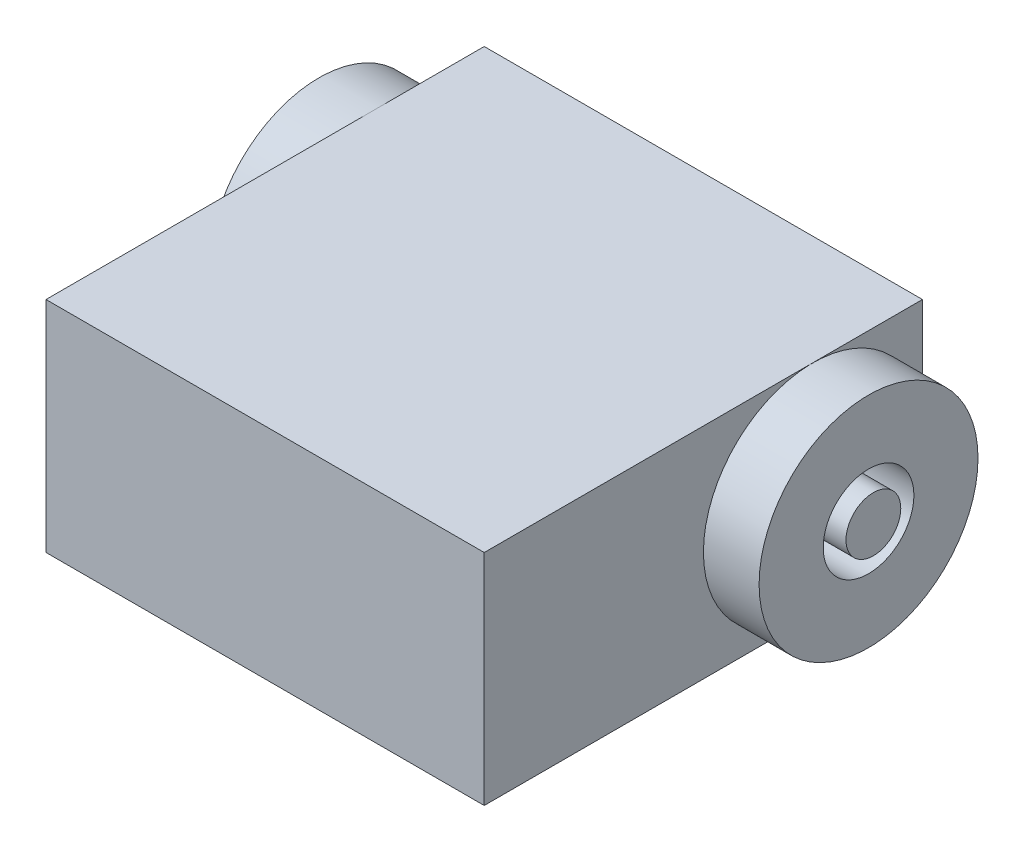
ISO-10303-21;
HEADER;
FILE_DESCRIPTION(('STEP AP214'),'2;1');
FILE_NAME('part.step','',(''),(''),'','','');
FILE_SCHEMA(('AUTOMOTIVE_DESIGN { 1 0 10303 214 1 1 1 1 }'));
ENDSEC;
DATA;
#1=APPLICATION_CONTEXT('core data for automotive mechanical design processes');
#2=APPLICATION_PROTOCOL_DEFINITION('international standard','automotive_design',2000,#1);
#3=PRODUCT_CONTEXT('',#1,'mechanical');
#4=PRODUCT('Part','Part','',(#3));
#5=PRODUCT_RELATED_PRODUCT_CATEGORY('part','',(#4));
#6=PRODUCT_DEFINITION_FORMATION('','',#4);
#7=PRODUCT_DEFINITION_CONTEXT('part definition',#1,'design');
#8=PRODUCT_DEFINITION('design','',#6,#7);
#9=PRODUCT_DEFINITION_SHAPE('','',#8);
#10=(LENGTH_UNIT() NAMED_UNIT(*) SI_UNIT(.MILLI.,.METRE.));
#11=(NAMED_UNIT(*) PLANE_ANGLE_UNIT() SI_UNIT($,.RADIAN.));
#12=(NAMED_UNIT(*) SI_UNIT($,.STERADIAN.) SOLID_ANGLE_UNIT());
#13=UNCERTAINTY_MEASURE_WITH_UNIT(LENGTH_MEASURE(1.E-05),#10,'distance_accuracy_value','');
#14=(GEOMETRIC_REPRESENTATION_CONTEXT(3) GLOBAL_UNCERTAINTY_ASSIGNED_CONTEXT((#13)) GLOBAL_UNIT_ASSIGNED_CONTEXT((#10,
#11,#12)) REPRESENTATION_CONTEXT('',''));
#15=CARTESIAN_POINT('',(0.,0.,0.));
#16=DIRECTION('',(0.,0.,1.));
#17=DIRECTION('',(1.,0.,0.));
#18=AXIS2_PLACEMENT_3D('',#15,#16,#17);
#19=CARTESIAN_POINT('',(-20.,20.,20.));
#20=DIRECTION('',(1.,0.,0.));
#21=DIRECTION('',(0.,0.,-1.));
#22=AXIS2_PLACEMENT_3D('',#19,#20,#21);
#23=PLANE('',#22);
#24=CARTESIAN_POINT('',(-20.,10.,-10.));
#25=DIRECTION('',(1.,0.,0.));
#26=DIRECTION('',(0.,0.,-1.));
#27=AXIS2_PLACEMENT_3D('',#24,#25,#26);
#28=CIRCLE('',#27,9.99095764515828);
#29=CARTESIAN_POINT('',(-20.,10.,-19.9909576451583));
#30=VERTEX_POINT('',#29);
#31=EDGE_CURVE('E224',#30,#30,#28,.T.);
#32=ORIENTED_EDGE('',*,*,#31,.T.);
#33=EDGE_LOOP('',(#32));
#34=FACE_BOUND('',#33,.T.);
#35=DIRECTION('',(0.,0.,1.));
#36=VECTOR('',#35,1.);
#37=CARTESIAN_POINT('',(-20.,0.,20.));
#38=LINE('',#37,#36);
#39=CARTESIAN_POINT('',(-20.,0.,-20.));
#40=VERTEX_POINT('',#39);
#41=CARTESIAN_POINT('',(-20.,0.,20.));
#42=VERTEX_POINT('',#41);
#43=EDGE_CURVE('E110',#40,#42,#38,.T.);
#44=ORIENTED_EDGE('',*,*,#43,.T.);
#45=DIRECTION('',(0.,-1.,0.));
#46=VECTOR('',#45,1.);
#47=CARTESIAN_POINT('',(-20.,20.,20.));
#48=LINE('',#47,#46);
#49=CARTESIAN_POINT('',(-20.,20.,20.));
#50=VERTEX_POINT('',#49);
#51=EDGE_CURVE('E101',#50,#42,#48,.T.);
#52=ORIENTED_EDGE('',*,*,#51,.F.);
#53=DIRECTION('',(0.,0.,1.));
#54=VECTOR('',#53,1.);
#55=CARTESIAN_POINT('',(-20.,20.,20.));
#56=LINE('',#55,#54);
#57=CARTESIAN_POINT('',(-20.,20.,-20.));
#58=VERTEX_POINT('',#57);
#59=EDGE_CURVE('E95',#58,#50,#56,.T.);
#60=ORIENTED_EDGE('',*,*,#59,.F.);
#61=DIRECTION('',(0.,-1.,0.));
#62=VECTOR('',#61,1.);
#63=CARTESIAN_POINT('',(-20.,20.,-20.));
#64=LINE('',#63,#62);
#65=EDGE_CURVE('E106',#58,#40,#64,.T.);
#66=ORIENTED_EDGE('',*,*,#65,.T.);
#67=EDGE_LOOP('',(#44,#52,#60,#66));
#68=FACE_BOUND('',#67,.T.);
#69=ADVANCED_FACE('F43',(#34,#68),#23,.F.);
#70=CARTESIAN_POINT('',(-20.,20.,20.));
#71=DIRECTION('',(0.,0.,-1.));
#72=DIRECTION('',(-1.,0.,0.));
#73=AXIS2_PLACEMENT_3D('',#70,#71,#72);
#74=PLANE('',#73);
#75=DIRECTION('',(1.,0.,0.));
#76=VECTOR('',#75,1.);
#77=CARTESIAN_POINT('',(-20.,0.,20.));
#78=LINE('',#77,#76);
#79=CARTESIAN_POINT('',(20.,0.,20.));
#80=VERTEX_POINT('',#79);
#81=EDGE_CURVE('E100',#42,#80,#78,.T.);
#82=ORIENTED_EDGE('',*,*,#81,.T.);
#83=DIRECTION('',(0.,-1.,0.));
#84=VECTOR('',#83,1.);
#85=CARTESIAN_POINT('',(20.,20.,20.));
#86=LINE('',#85,#84);
#87=CARTESIAN_POINT('',(20.,20.,20.));
#88=VERTEX_POINT('',#87);
#89=EDGE_CURVE('E98',#88,#80,#86,.T.);
#90=ORIENTED_EDGE('',*,*,#89,.F.);
#91=DIRECTION('',(1.,0.,0.));
#92=VECTOR('',#91,1.);
#93=CARTESIAN_POINT('',(-20.,20.,20.));
#94=LINE('',#93,#92);
#95=EDGE_CURVE('E90',#50,#88,#94,.T.);
#96=ORIENTED_EDGE('',*,*,#95,.F.);
#97=ORIENTED_EDGE('',*,*,#51,.T.);
#98=EDGE_LOOP('',(#82,#90,#96,#97));
#99=FACE_BOUND('',#98,.T.);
#100=ADVANCED_FACE('F99',(#99),#74,.F.);
#101=CARTESIAN_POINT('',(20.,20.,20.));
#102=DIRECTION('',(-1.,0.,0.));
#103=DIRECTION('',(0.,0.,1.));
#104=AXIS2_PLACEMENT_3D('',#101,#102,#103);
#105=PLANE('',#104);
#106=CARTESIAN_POINT('',(20.,10.,-10.));
#107=DIRECTION('',(-1.,0.,0.));
#108=DIRECTION('',(0.,0.,1.));
#109=AXIS2_PLACEMENT_3D('',#106,#107,#108);
#110=CIRCLE('',#109,9.99095764515828);
#111=CARTESIAN_POINT('',(20.,10.,-0.00904235484172101));
#112=VERTEX_POINT('',#111);
#113=EDGE_CURVE('E51',#112,#112,#110,.F.);
#114=ORIENTED_EDGE('',*,*,#113,.F.);
#115=EDGE_LOOP('',(#114));
#116=FACE_BOUND('',#115,.T.);
#117=DIRECTION('',(0.,0.,-1.));
#118=VECTOR('',#117,1.);
#119=CARTESIAN_POINT('',(20.,0.,20.));
#120=LINE('',#119,#118);
#121=CARTESIAN_POINT('',(20.,0.,-20.));
#122=VERTEX_POINT('',#121);
#123=EDGE_CURVE('E76',#80,#122,#120,.T.);
#124=ORIENTED_EDGE('',*,*,#123,.T.);
#125=DIRECTION('',(0.,-1.,0.));
#126=VECTOR('',#125,1.);
#127=CARTESIAN_POINT('',(20.,20.,-20.));
#128=LINE('',#127,#126);
#129=CARTESIAN_POINT('',(20.,20.,-20.));
#130=VERTEX_POINT('',#129);
#131=EDGE_CURVE('E102',#130,#122,#128,.T.);
#132=ORIENTED_EDGE('',*,*,#131,.F.);
#133=DIRECTION('',(0.,0.,-1.));
#134=VECTOR('',#133,1.);
#135=CARTESIAN_POINT('',(20.,20.,20.));
#136=LINE('',#135,#134);
#137=EDGE_CURVE('E93',#88,#130,#136,.T.);
#138=ORIENTED_EDGE('',*,*,#137,.F.);
#139=ORIENTED_EDGE('',*,*,#89,.T.);
#140=EDGE_LOOP('',(#124,#132,#138,#139));
#141=FACE_BOUND('',#140,.T.);
#142=ADVANCED_FACE('F104',(#116,#141),#105,.F.);
#143=CARTESIAN_POINT('',(-20.,20.,-20.));
#144=DIRECTION('',(0.,0.,1.));
#145=DIRECTION('',(1.,0.,0.));
#146=AXIS2_PLACEMENT_3D('',#143,#144,#145);
#147=PLANE('',#146);
#148=DIRECTION('',(-1.,0.,0.));
#149=VECTOR('',#148,1.);
#150=CARTESIAN_POINT('',(-20.,0.,-20.));
#151=LINE('',#150,#149);
#152=EDGE_CURVE('E82',#122,#40,#151,.T.);
#153=ORIENTED_EDGE('',*,*,#152,.T.);
#154=ORIENTED_EDGE('',*,*,#65,.F.);
#155=DIRECTION('',(-1.,0.,0.));
#156=VECTOR('',#155,1.);
#157=CARTESIAN_POINT('',(-20.,20.,-20.));
#158=LINE('',#157,#156);
#159=EDGE_CURVE('E59',#130,#58,#158,.T.);
#160=ORIENTED_EDGE('',*,*,#159,.F.);
#161=ORIENTED_EDGE('',*,*,#131,.T.);
#162=EDGE_LOOP('',(#153,#154,#160,#161));
#163=FACE_BOUND('',#162,.T.);
#164=ADVANCED_FACE('F128',(#163),#147,.F.);
#165=CARTESIAN_POINT('',(0.,20.,0.));
#166=DIRECTION('',(0.,-1.,0.));
#167=DIRECTION('',(0.,0.,-1.));
#168=AXIS2_PLACEMENT_3D('',#165,#166,#167);
#169=PLANE('',#168);
#170=ORIENTED_EDGE('',*,*,#59,.T.);
#171=ORIENTED_EDGE('',*,*,#95,.T.);
#172=ORIENTED_EDGE('',*,*,#137,.T.);
#173=ORIENTED_EDGE('',*,*,#159,.T.);
#174=EDGE_LOOP('',(#170,#171,#172,#173));
#175=FACE_BOUND('',#174,.T.);
#176=ADVANCED_FACE('F91',(#175),#169,.F.);
#177=CARTESIAN_POINT('',(0.,0.,0.));
#178=DIRECTION('',(0.,-1.,0.));
#179=DIRECTION('',(0.,0.,-1.));
#180=AXIS2_PLACEMENT_3D('',#177,#178,#179);
#181=PLANE('',#180);
#182=ORIENTED_EDGE('',*,*,#43,.F.);
#183=ORIENTED_EDGE('',*,*,#152,.F.);
#184=ORIENTED_EDGE('',*,*,#123,.F.);
#185=ORIENTED_EDGE('',*,*,#81,.F.);
#186=EDGE_LOOP('',(#182,#183,#184,#185));
#187=FACE_BOUND('',#186,.T.);
#188=ADVANCED_FACE('F189',(#187),#181,.T.);
#189=CARTESIAN_POINT('',(25.08,10.,-10.));
#190=DIRECTION('',(1.,0.,0.));
#191=DIRECTION('',(0.,0.,-1.));
#192=AXIS2_PLACEMENT_3D('',#189,#190,#191);
#193=PLANE('',#192);
#194=CARTESIAN_POINT('',(25.08,10.,-10.));
#195=DIRECTION('',(1.,0.,0.));
#196=DIRECTION('',(0.,0.,-1.));
#197=AXIS2_PLACEMENT_3D('',#194,#195,#196);
#198=CIRCLE('',#197,9.99095764515828);
#199=CARTESIAN_POINT('',(25.08,10.,-19.9909576451583));
#200=VERTEX_POINT('',#199);
#201=EDGE_CURVE('E212',#200,#200,#198,.T.);
#202=ORIENTED_EDGE('',*,*,#201,.T.);
#203=EDGE_LOOP('',(#202));
#204=FACE_BOUND('',#203,.T.);
#205=CARTESIAN_POINT('',(25.08,10.,-10.));
#206=DIRECTION('',(1.,0.,0.));
#207=DIRECTION('',(0.,0.,-1.));
#208=AXIS2_PLACEMENT_3D('',#205,#206,#207);
#209=CIRCLE('',#208,4.14087197211609);
#210=CARTESIAN_POINT('',(25.08,10.,-14.1408719721161));
#211=VERTEX_POINT('',#210);
#212=EDGE_CURVE('E217',#211,#211,#209,.T.);
#213=ORIENTED_EDGE('',*,*,#212,.F.);
#214=EDGE_LOOP('',(#213));
#215=FACE_BOUND('',#214,.T.);
#216=ADVANCED_FACE('F186',(#204,#215),#193,.T.);
#217=CARTESIAN_POINT('',(25.08,10.,-10.));
#218=DIRECTION('',(-1.,0.,0.));
#219=DIRECTION('',(0.,0.,1.));
#220=AXIS2_PLACEMENT_3D('',#217,#218,#219);
#221=CYLINDRICAL_SURFACE('',#220,9.99095764515828);
#222=ORIENTED_EDGE('',*,*,#201,.F.);
#223=EDGE_LOOP('',(#222));
#224=FACE_BOUND('',#223,.T.);
#225=ORIENTED_EDGE('',*,*,#113,.T.);
#226=EDGE_LOOP('',(#225));
#227=FACE_BOUND('',#226,.T.);
#228=ADVANCED_FACE('F125',(#224,#227),#221,.T.);
#229=CARTESIAN_POINT('',(25.08,10.,-10.));
#230=DIRECTION('',(-1.,0.,0.));
#231=DIRECTION('',(0.,0.,1.));
#232=AXIS2_PLACEMENT_3D('',#229,#230,#231);
#233=CYLINDRICAL_SURFACE('',#232,4.14087197211609);
#234=ORIENTED_EDGE('',*,*,#212,.T.);
#235=EDGE_LOOP('',(#234));
#236=FACE_BOUND('',#235,.T.);
#237=CARTESIAN_POINT('',(20.,10.,-10.));
#238=DIRECTION('',(1.,0.,0.));
#239=DIRECTION('',(0.,0.,-1.));
#240=AXIS2_PLACEMENT_3D('',#237,#238,#239);
#241=CIRCLE('',#240,4.14087197211609);
#242=CARTESIAN_POINT('',(20.,10.,-14.1408719721161));
#243=VERTEX_POINT('',#242);
#244=EDGE_CURVE('E218',#243,#243,#241,.T.);
#245=ORIENTED_EDGE('',*,*,#244,.F.);
#246=EDGE_LOOP('',(#245));
#247=FACE_BOUND('',#246,.T.);
#248=ADVANCED_FACE('F181',(#236,#247),#233,.F.);
#249=CARTESIAN_POINT('',(25.522,10.,-10.));
#250=DIRECTION('',(1.,0.,0.));
#251=DIRECTION('',(0.,0.,-1.));
#252=AXIS2_PLACEMENT_3D('',#249,#250,#251);
#253=PLANE('',#252);
#254=CARTESIAN_POINT('',(25.522,10.,-10.));
#255=DIRECTION('',(1.,0.,0.));
#256=DIRECTION('',(0.,0.,-1.));
#257=AXIS2_PLACEMENT_3D('',#254,#255,#256);
#258=CIRCLE('',#257,2.5);
#259=CARTESIAN_POINT('',(25.522,10.,-12.5));
#260=VERTEX_POINT('',#259);
#261=EDGE_CURVE('E113',#260,#260,#258,.T.);
#262=ORIENTED_EDGE('',*,*,#261,.T.);
#263=EDGE_LOOP('',(#262));
#264=FACE_BOUND('',#263,.T.);
#265=ADVANCED_FACE('F184',(#264),#253,.T.);
#266=CARTESIAN_POINT('',(25.522,10.,-10.));
#267=DIRECTION('',(-1.,0.,0.));
#268=DIRECTION('',(0.,0.,1.));
#269=AXIS2_PLACEMENT_3D('',#266,#267,#268);
#270=CYLINDRICAL_SURFACE('',#269,2.5);
#271=ORIENTED_EDGE('',*,*,#261,.F.);
#272=EDGE_LOOP('',(#271));
#273=FACE_BOUND('',#272,.T.);
#274=CARTESIAN_POINT('',(20.,10.,-10.));
#275=DIRECTION('',(-1.,0.,0.));
#276=DIRECTION('',(0.,0.,1.));
#277=AXIS2_PLACEMENT_3D('',#274,#275,#276);
#278=CIRCLE('',#277,2.5);
#279=CARTESIAN_POINT('',(20.,10.,-7.50000000000001));
#280=VERTEX_POINT('',#279);
#281=EDGE_CURVE('E120',#280,#280,#278,.F.);
#282=ORIENTED_EDGE('',*,*,#281,.T.);
#283=EDGE_LOOP('',(#282));
#284=FACE_BOUND('',#283,.T.);
#285=ADVANCED_FACE('F138',(#273,#284),#270,.T.);
#286=ORIENTED_EDGE('',*,*,#281,.F.);
#287=EDGE_LOOP('',(#286));
#288=FACE_BOUND('',#287,.T.);
#289=ORIENTED_EDGE('',*,*,#244,.T.);
#290=EDGE_LOOP('',(#289));
#291=FACE_BOUND('',#290,.T.);
#292=ADVANCED_FACE('F130',(#288,#291),#105,.F.);
#293=CARTESIAN_POINT('',(-25.08,10.,-10.));
#294=DIRECTION('',(1.,0.,0.));
#295=DIRECTION('',(0.,0.,-1.));
#296=AXIS2_PLACEMENT_3D('',#293,#294,#295);
#297=CYLINDRICAL_SURFACE('',#296,9.99095764515828);
#298=CARTESIAN_POINT('',(-25.08,10.,-10.));
#299=DIRECTION('',(1.,0.,0.));
#300=DIRECTION('',(0.,0.,-1.));
#301=AXIS2_PLACEMENT_3D('',#298,#299,#300);
#302=CIRCLE('',#301,9.99095764515828);
#303=CARTESIAN_POINT('',(-25.08,10.,-19.9909576451583));
#304=VERTEX_POINT('',#303);
#305=EDGE_CURVE('E221',#304,#304,#302,.T.);
#306=ORIENTED_EDGE('',*,*,#305,.T.);
#307=EDGE_LOOP('',(#306));
#308=FACE_BOUND('',#307,.T.);
#309=ORIENTED_EDGE('',*,*,#31,.F.);
#310=EDGE_LOOP('',(#309));
#311=FACE_BOUND('',#310,.T.);
#312=ADVANCED_FACE('F137',(#308,#311),#297,.T.);
#313=CARTESIAN_POINT('',(-25.08,10.,-10.));
#314=DIRECTION('',(-1.,0.,0.));
#315=DIRECTION('',(0.,0.,-1.));
#316=AXIS2_PLACEMENT_3D('',#313,#314,#315);
#317=PLANE('',#316);
#318=CARTESIAN_POINT('',(-25.08,10.,-10.));
#319=DIRECTION('',(1.,0.,0.));
#320=DIRECTION('',(0.,0.,-1.));
#321=AXIS2_PLACEMENT_3D('',#318,#319,#320);
#322=CIRCLE('',#321,4.14087197211609);
#323=CARTESIAN_POINT('',(-25.08,10.,-14.1408719721161));
#324=VERTEX_POINT('',#323);
#325=EDGE_CURVE('E226',#324,#324,#322,.T.);
#326=ORIENTED_EDGE('',*,*,#325,.T.);
#327=EDGE_LOOP('',(#326));
#328=FACE_BOUND('',#327,.T.);
#329=ORIENTED_EDGE('',*,*,#305,.F.);
#330=EDGE_LOOP('',(#329));
#331=FACE_BOUND('',#330,.T.);
#332=ADVANCED_FACE('F164',(#328,#331),#317,.T.);
#333=CARTESIAN_POINT('',(-25.08,10.,-10.));
#334=DIRECTION('',(1.,0.,0.));
#335=DIRECTION('',(0.,0.,-1.));
#336=AXIS2_PLACEMENT_3D('',#333,#334,#335);
#337=CYLINDRICAL_SURFACE('',#336,4.14087197211609);
#338=ORIENTED_EDGE('',*,*,#325,.F.);
#339=EDGE_LOOP('',(#338));
#340=FACE_BOUND('',#339,.T.);
#341=CARTESIAN_POINT('',(-20.,10.,-10.));
#342=DIRECTION('',(1.,0.,0.));
#343=DIRECTION('',(0.,0.,-1.));
#344=AXIS2_PLACEMENT_3D('',#341,#342,#343);
#345=CIRCLE('',#344,4.14087197211609);
#346=CARTESIAN_POINT('',(-20.,10.,-14.1408719721161));
#347=VERTEX_POINT('',#346);
#348=EDGE_CURVE('E11',#347,#347,#345,.T.);
#349=ORIENTED_EDGE('',*,*,#348,.T.);
#350=EDGE_LOOP('',(#349));
#351=FACE_BOUND('',#350,.T.);
#352=ADVANCED_FACE('F162',(#340,#351),#337,.F.);
#353=CARTESIAN_POINT('',(-25.522,10.,-10.));
#354=DIRECTION('',(-1.,0.,0.));
#355=DIRECTION('',(0.,0.,-1.));
#356=AXIS2_PLACEMENT_3D('',#353,#354,#355);
#357=PLANE('',#356);
#358=CARTESIAN_POINT('',(-25.522,10.,-10.));
#359=DIRECTION('',(1.,0.,0.));
#360=DIRECTION('',(0.,0.,-1.));
#361=AXIS2_PLACEMENT_3D('',#358,#359,#360);
#362=CIRCLE('',#361,2.5);
#363=CARTESIAN_POINT('',(-25.522,10.,-12.5));
#364=VERTEX_POINT('',#363);
#365=EDGE_CURVE('E210',#364,#364,#362,.T.);
#366=ORIENTED_EDGE('',*,*,#365,.F.);
#367=EDGE_LOOP('',(#366));
#368=FACE_BOUND('',#367,.T.);
#369=ADVANCED_FACE('F153',(#368),#357,.T.);
#370=CARTESIAN_POINT('',(-25.522,10.,-10.));
#371=DIRECTION('',(1.,0.,0.));
#372=DIRECTION('',(0.,0.,-1.));
#373=AXIS2_PLACEMENT_3D('',#370,#371,#372);
#374=CYLINDRICAL_SURFACE('',#373,2.5);
#375=ORIENTED_EDGE('',*,*,#365,.T.);
#376=EDGE_LOOP('',(#375));
#377=FACE_BOUND('',#376,.T.);
#378=CARTESIAN_POINT('',(-20.,10.,-10.));
#379=DIRECTION('',(1.,0.,0.));
#380=DIRECTION('',(0.,0.,-1.));
#381=AXIS2_PLACEMENT_3D('',#378,#379,#380);
#382=CIRCLE('',#381,2.5);
#383=CARTESIAN_POINT('',(-20.,10.,-12.5));
#384=VERTEX_POINT('',#383);
#385=EDGE_CURVE('E159',#384,#384,#382,.T.);
#386=ORIENTED_EDGE('',*,*,#385,.F.);
#387=EDGE_LOOP('',(#386));
#388=FACE_BOUND('',#387,.T.);
#389=ADVANCED_FACE('F148',(#377,#388),#374,.T.);
#390=ORIENTED_EDGE('',*,*,#385,.T.);
#391=EDGE_LOOP('',(#390));
#392=FACE_BOUND('',#391,.T.);
#393=ORIENTED_EDGE('',*,*,#348,.F.);
#394=EDGE_LOOP('',(#393));
#395=FACE_BOUND('',#394,.T.);
#396=ADVANCED_FACE('F142',(#392,#395),#23,.F.);
#397=CLOSED_SHELL('',(#69,#100,#142,#164,#176,#188,#216,#228,#248,#265,#285,#292,#312,#332,#352,
#369,#389,#396));
#398=MANIFOLD_SOLID_BREP('B2',#397);
#399=ADVANCED_BREP_SHAPE_REPRESENTATION('',(#18,#398),#14);
#400=SHAPE_DEFINITION_REPRESENTATION(#9,#399);
ENDSEC;
END-ISO-10303-21;
